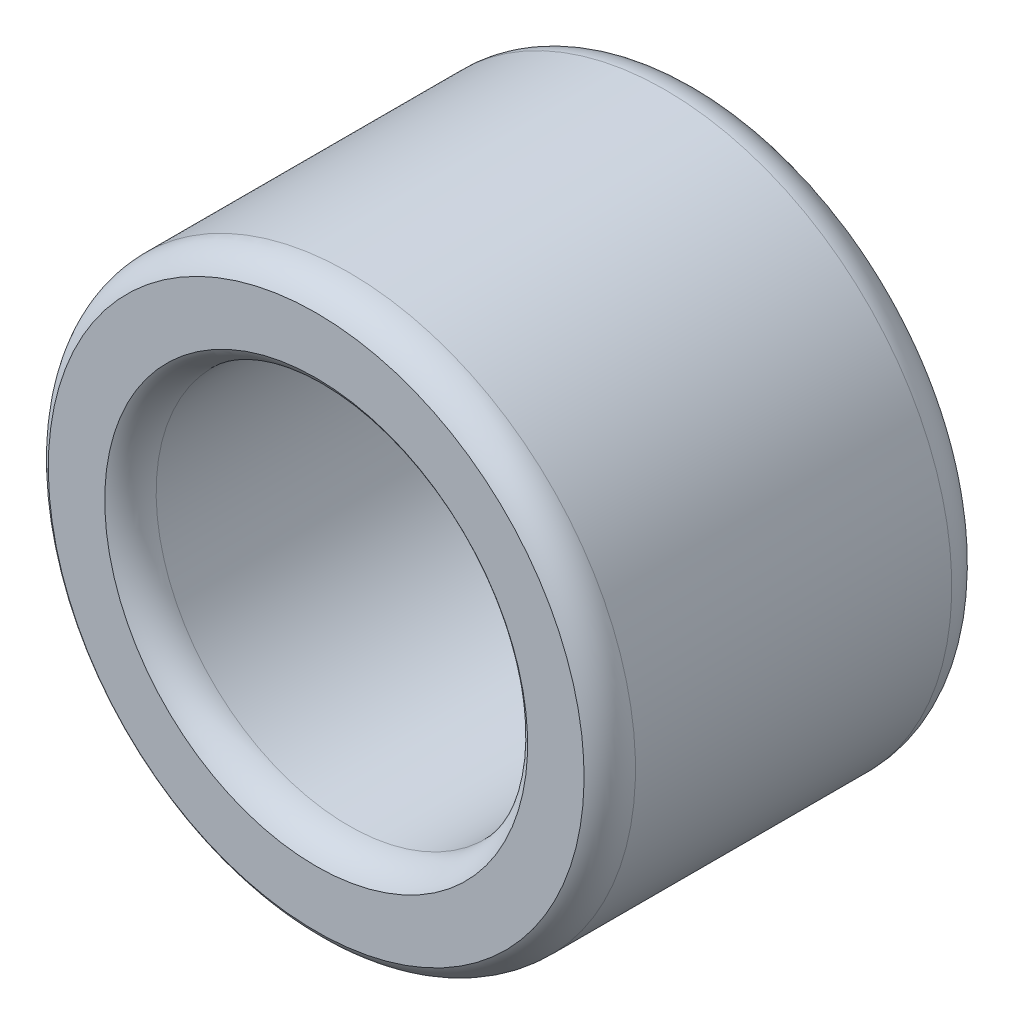
ISO-10303-21;
HEADER;
FILE_DESCRIPTION(('STEP AP214'),'2;1');
FILE_NAME('part.step','',(''),(''),'','','');
FILE_SCHEMA(('AUTOMOTIVE_DESIGN { 1 0 10303 214 1 1 1 1 }'));
ENDSEC;
DATA;
#1=APPLICATION_CONTEXT('core data for automotive mechanical design processes');
#2=APPLICATION_PROTOCOL_DEFINITION('international standard','automotive_design',2000,#1);
#3=PRODUCT_CONTEXT('',#1,'mechanical');
#4=PRODUCT('Part','Part','',(#3));
#5=PRODUCT_RELATED_PRODUCT_CATEGORY('part','',(#4));
#6=PRODUCT_DEFINITION_FORMATION('','',#4);
#7=PRODUCT_DEFINITION_CONTEXT('part definition',#1,'design');
#8=PRODUCT_DEFINITION('design','',#6,#7);
#9=PRODUCT_DEFINITION_SHAPE('','',#8);
#10=(LENGTH_UNIT() NAMED_UNIT(*) SI_UNIT(.MILLI.,.METRE.));
#11=(NAMED_UNIT(*) PLANE_ANGLE_UNIT() SI_UNIT($,.RADIAN.));
#12=(NAMED_UNIT(*) SI_UNIT($,.STERADIAN.) SOLID_ANGLE_UNIT());
#13=UNCERTAINTY_MEASURE_WITH_UNIT(LENGTH_MEASURE(1.E-05),#10,'distance_accuracy_value','');
#14=(GEOMETRIC_REPRESENTATION_CONTEXT(3) GLOBAL_UNCERTAINTY_ASSIGNED_CONTEXT((#13)) GLOBAL_UNIT_ASSIGNED_CONTEXT((#10,
#11,#12)) REPRESENTATION_CONTEXT('',''));
#15=CARTESIAN_POINT('',(0.,0.,0.));
#16=DIRECTION('',(0.,0.,1.));
#17=DIRECTION('',(1.,0.,0.));
#18=AXIS2_PLACEMENT_3D('',#15,#16,#17);
#19=CARTESIAN_POINT('',(0.,0.,3.175));
#20=DIRECTION('',(0.,0.,-1.));
#21=DIRECTION('',(-1.,0.,0.));
#22=AXIS2_PLACEMENT_3D('',#19,#20,#21);
#23=CYLINDRICAL_SURFACE('',#22,4.77266);
#24=CARTESIAN_POINT('',(0.,0.,2.63255286398396));
#25=DIRECTION('',(0.,0.,-1.));
#26=DIRECTION('',(0.,1.,0.));
#27=AXIS2_PLACEMENT_3D('',#24,#25,#26);
#28=CIRCLE('',#27,4.77266);
#29=CARTESIAN_POINT('',(0.,4.77266,2.63255286398396));
#30=VERTEX_POINT('',#29);
#31=EDGE_CURVE('E64',#30,#30,#28,.T.);
#32=ORIENTED_EDGE('',*,*,#31,.T.);
#33=EDGE_LOOP('',(#32));
#34=FACE_BOUND('',#33,.T.);
#35=CARTESIAN_POINT('',(0.,0.,-2.63255286398396));
#36=DIRECTION('',(0.,0.,-1.));
#37=DIRECTION('',(0.,1.,0.));
#38=AXIS2_PLACEMENT_3D('',#35,#36,#37);
#39=CIRCLE('',#38,4.77266);
#40=CARTESIAN_POINT('',(0.,4.77266,-2.63255286398396));
#41=VERTEX_POINT('',#40);
#42=EDGE_CURVE('E79',#41,#41,#39,.T.);
#43=ORIENTED_EDGE('',*,*,#42,.F.);
#44=EDGE_LOOP('',(#43));
#45=FACE_BOUND('',#44,.T.);
#46=ADVANCED_FACE('F43',(#34,#45),#23,.T.);
#47=CARTESIAN_POINT('',(0.,0.,-2.63255286398396));
#48=DIRECTION('',(0.,0.,-1.));
#49=DIRECTION('',(0.,1.,0.));
#50=AXIS2_PLACEMENT_3D('',#47,#48,#49);
#51=TOROIDAL_SURFACE('',#50,4.146296,0.626364000000001);
#52=CARTESIAN_POINT('',(0.,0.,-3.175));
#53=DIRECTION('',(0.,0.,-1.));
#54=DIRECTION('',(0.,1.,0.));
#55=AXIS2_PLACEMENT_3D('',#52,#53,#54);
#56=CIRCLE('',#55,4.459478);
#57=CARTESIAN_POINT('',(0.,4.459478,-3.175));
#58=VERTEX_POINT('',#57);
#59=EDGE_CURVE('E75',#58,#58,#56,.T.);
#60=ORIENTED_EDGE('',*,*,#59,.F.);
#61=EDGE_LOOP('',(#60));
#62=FACE_BOUND('',#61,.T.);
#63=ORIENTED_EDGE('',*,*,#42,.T.);
#64=EDGE_LOOP('',(#63));
#65=FACE_BOUND('',#64,.T.);
#66=ADVANCED_FACE('F88',(#62,#65),#51,.T.);
#67=CARTESIAN_POINT('',(0.,0.,2.63255286398396));
#68=DIRECTION('',(0.,0.,-1.));
#69=DIRECTION('',(0.,1.,0.));
#70=AXIS2_PLACEMENT_3D('',#67,#68,#69);
#71=TOROIDAL_SURFACE('',#70,4.146296,0.626364000000001);
#72=ORIENTED_EDGE('',*,*,#31,.F.);
#73=EDGE_LOOP('',(#72));
#74=FACE_BOUND('',#73,.T.);
#75=CARTESIAN_POINT('',(0.,0.,3.175));
#76=DIRECTION('',(0.,0.,-1.));
#77=DIRECTION('',(0.,1.,0.));
#78=AXIS2_PLACEMENT_3D('',#75,#76,#77);
#79=CIRCLE('',#78,4.459478);
#80=CARTESIAN_POINT('',(0.,4.459478,3.175));
#81=VERTEX_POINT('',#80);
#82=EDGE_CURVE('E68',#81,#81,#79,.T.);
#83=ORIENTED_EDGE('',*,*,#82,.T.);
#84=EDGE_LOOP('',(#83));
#85=FACE_BOUND('',#84,.T.);
#86=ADVANCED_FACE('F91',(#74,#85),#71,.T.);
#87=CARTESIAN_POINT('',(0.,0.,-3.175));
#88=DIRECTION('',(0.,0.,1.));
#89=DIRECTION('',(1.,0.,0.));
#90=AXIS2_PLACEMENT_3D('',#87,#88,#89);
#91=PLANE('',#90);
#92=ORIENTED_EDGE('',*,*,#59,.T.);
#93=EDGE_LOOP('',(#92));
#94=FACE_BOUND('',#93,.T.);
#95=CARTESIAN_POINT('',(0.,0.,-3.175));
#96=DIRECTION('',(0.,0.,-1.));
#97=DIRECTION('',(0.,1.,0.));
#98=AXIS2_PLACEMENT_3D('',#95,#96,#97);
#99=CIRCLE('',#98,3.519932);
#100=CARTESIAN_POINT('',(0.,3.519932,-3.175));
#101=VERTEX_POINT('',#100);
#102=EDGE_CURVE('E57',#101,#101,#99,.T.);
#103=ORIENTED_EDGE('',*,*,#102,.F.);
#104=EDGE_LOOP('',(#103));
#105=FACE_BOUND('',#104,.T.);
#106=ADVANCED_FACE('F99',(#94,#105),#91,.F.);
#107=CARTESIAN_POINT('',(0.,0.,3.175));
#108=DIRECTION('',(0.,0.,1.));
#109=DIRECTION('',(1.,0.,0.));
#110=AXIS2_PLACEMENT_3D('',#107,#108,#109);
#111=PLANE('',#110);
#112=ORIENTED_EDGE('',*,*,#82,.F.);
#113=EDGE_LOOP('',(#112));
#114=FACE_BOUND('',#113,.T.);
#115=CARTESIAN_POINT('',(0.,0.,3.175));
#116=DIRECTION('',(0.,0.,-1.));
#117=DIRECTION('',(0.,1.,0.));
#118=AXIS2_PLACEMENT_3D('',#115,#116,#117);
#119=CIRCLE('',#118,3.519932);
#120=CARTESIAN_POINT('',(0.,3.519932,3.175));
#121=VERTEX_POINT('',#120);
#122=EDGE_CURVE('E10',#121,#121,#119,.T.);
#123=ORIENTED_EDGE('',*,*,#122,.T.);
#124=EDGE_LOOP('',(#123));
#125=FACE_BOUND('',#124,.T.);
#126=ADVANCED_FACE('F102',(#114,#125),#111,.T.);
#127=CARTESIAN_POINT('',(0.,0.,2.63255286398396));
#128=DIRECTION('',(0.,0.,-1.));
#129=DIRECTION('',(0.,1.,0.));
#130=AXIS2_PLACEMENT_3D('',#127,#128,#129);
#131=TOROIDAL_SURFACE('',#130,3.833114,0.626364000000002);
#132=ORIENTED_EDGE('',*,*,#122,.F.);
#133=EDGE_LOOP('',(#132));
#134=FACE_BOUND('',#133,.T.);
#135=CARTESIAN_POINT('',(0.,0.,2.63255286398396));
#136=DIRECTION('',(0.,0.,-1.));
#137=DIRECTION('',(0.,1.,0.));
#138=AXIS2_PLACEMENT_3D('',#135,#136,#137);
#139=CIRCLE('',#138,3.20675);
#140=CARTESIAN_POINT('',(0.,3.20675,2.63255286398396));
#141=VERTEX_POINT('',#140);
#142=EDGE_CURVE('E49',#141,#141,#139,.T.);
#143=ORIENTED_EDGE('',*,*,#142,.T.);
#144=EDGE_LOOP('',(#143));
#145=FACE_BOUND('',#144,.T.);
#146=ADVANCED_FACE('F106',(#134,#145),#131,.T.);
#147=CARTESIAN_POINT('',(0.,0.,-2.63255286398396));
#148=DIRECTION('',(0.,0.,-1.));
#149=DIRECTION('',(0.,1.,0.));
#150=AXIS2_PLACEMENT_3D('',#147,#148,#149);
#151=TOROIDAL_SURFACE('',#150,3.833114,0.626364000000002);
#152=CARTESIAN_POINT('',(0.,0.,-2.63255286398396));
#153=DIRECTION('',(0.,0.,-1.));
#154=DIRECTION('',(0.,1.,0.));
#155=AXIS2_PLACEMENT_3D('',#152,#153,#154);
#156=CIRCLE('',#155,3.20675);
#157=CARTESIAN_POINT('',(0.,3.20675,-2.63255286398396));
#158=VERTEX_POINT('',#157);
#159=EDGE_CURVE('E65',#158,#158,#156,.T.);
#160=ORIENTED_EDGE('',*,*,#159,.F.);
#161=EDGE_LOOP('',(#160));
#162=FACE_BOUND('',#161,.T.);
#163=ORIENTED_EDGE('',*,*,#102,.T.);
#164=EDGE_LOOP('',(#163));
#165=FACE_BOUND('',#164,.T.);
#166=ADVANCED_FACE('F115',(#162,#165),#151,.T.);
#167=CARTESIAN_POINT('',(0.,0.,3.175));
#168=DIRECTION('',(0.,0.,-1.));
#169=DIRECTION('',(-1.,0.,0.));
#170=AXIS2_PLACEMENT_3D('',#167,#168,#169);
#171=CYLINDRICAL_SURFACE('',#170,3.20675);
#172=ORIENTED_EDGE('',*,*,#142,.F.);
#173=EDGE_LOOP('',(#172));
#174=FACE_BOUND('',#173,.T.);
#175=ORIENTED_EDGE('',*,*,#159,.T.);
#176=EDGE_LOOP('',(#175));
#177=FACE_BOUND('',#176,.T.);
#178=ADVANCED_FACE('F120',(#174,#177),#171,.F.);
#179=CLOSED_SHELL('',(#46,#66,#86,#106,#126,#146,#166,#178));
#180=MANIFOLD_SOLID_BREP('B2',#179);
#181=ADVANCED_BREP_SHAPE_REPRESENTATION('',(#18,#180),#14);
#182=SHAPE_DEFINITION_REPRESENTATION(#9,#181);
ENDSEC;
END-ISO-10303-21;
